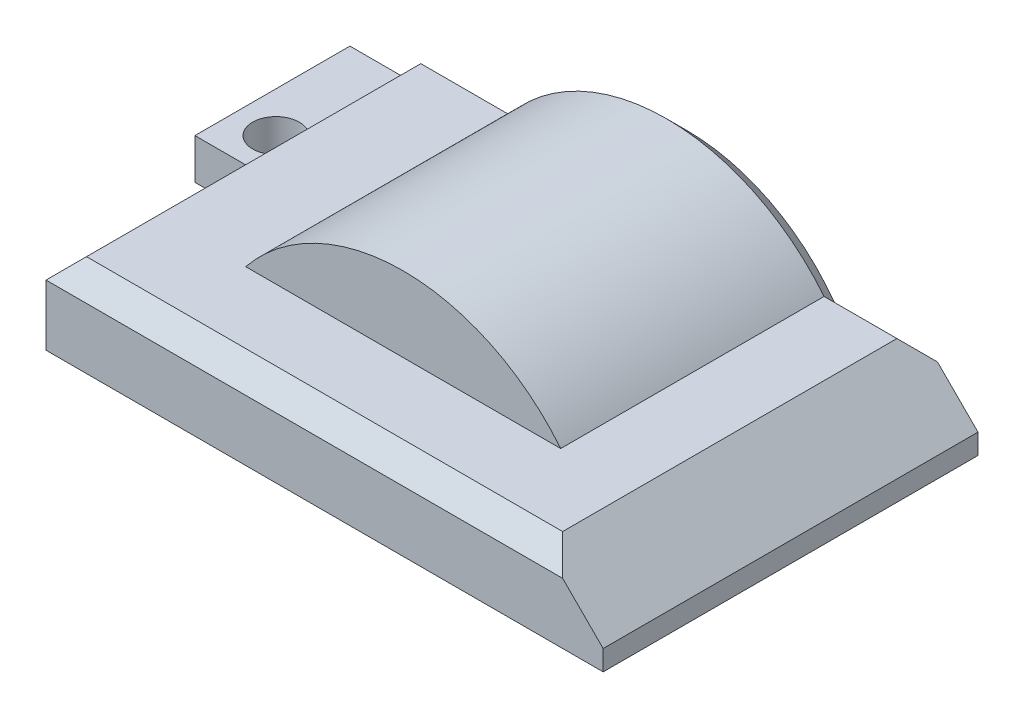
ISO-10303-21;
HEADER;
FILE_DESCRIPTION(('STEP AP214'),'2;1');
FILE_NAME('part.step','',(''),(''),'','','');
FILE_SCHEMA(('AUTOMOTIVE_DESIGN { 1 0 10303 214 1 1 1 1 }'));
ENDSEC;
DATA;
#1=APPLICATION_CONTEXT('core data for automotive mechanical design processes');
#2=APPLICATION_PROTOCOL_DEFINITION('international standard','automotive_design',2000,#1);
#3=PRODUCT_CONTEXT('',#1,'mechanical');
#4=PRODUCT('Part','Part','',(#3));
#5=PRODUCT_RELATED_PRODUCT_CATEGORY('part','',(#4));
#6=PRODUCT_DEFINITION_FORMATION('','',#4);
#7=PRODUCT_DEFINITION_CONTEXT('part definition',#1,'design');
#8=PRODUCT_DEFINITION('design','',#6,#7);
#9=PRODUCT_DEFINITION_SHAPE('','',#8);
#10=(LENGTH_UNIT() NAMED_UNIT(*) SI_UNIT(.MILLI.,.METRE.));
#11=(NAMED_UNIT(*) PLANE_ANGLE_UNIT() SI_UNIT($,.RADIAN.));
#12=(NAMED_UNIT(*) SI_UNIT($,.STERADIAN.) SOLID_ANGLE_UNIT());
#13=UNCERTAINTY_MEASURE_WITH_UNIT(LENGTH_MEASURE(1.E-05),#10,'distance_accuracy_value','');
#14=(GEOMETRIC_REPRESENTATION_CONTEXT(3) GLOBAL_UNCERTAINTY_ASSIGNED_CONTEXT((#13)) GLOBAL_UNIT_ASSIGNED_CONTEXT((#10,
#11,#12)) REPRESENTATION_CONTEXT('',''));
#15=CARTESIAN_POINT('',(0.,0.,0.));
#16=DIRECTION('',(0.,0.,1.));
#17=DIRECTION('',(1.,0.,0.));
#18=AXIS2_PLACEMENT_3D('',#15,#16,#17);
#19=CARTESIAN_POINT('',(0.,2.,0.));
#20=DIRECTION('',(0.,0.,-1.));
#21=DIRECTION('',(-1.,0.,0.));
#22=AXIS2_PLACEMENT_3D('',#19,#20,#21);
#23=PLANE('',#22);
#24=DIRECTION('',(0.,-1.,0.));
#25=VECTOR('',#24,1.);
#26=CARTESIAN_POINT('',(23.5,2.,0.));
#27=LINE('',#26,#25);
#28=CARTESIAN_POINT('',(23.5,2.,0.));
#29=VERTEX_POINT('',#28);
#30=CARTESIAN_POINT('',(23.5,0.,0.));
#31=VERTEX_POINT('',#30);
#32=EDGE_CURVE('E352',#29,#31,#27,.T.);
#33=ORIENTED_EDGE('',*,*,#32,.T.);
#34=DIRECTION('',(1.,0.,0.));
#35=VECTOR('',#34,1.);
#36=CARTESIAN_POINT('',(0.,0.,0.));
#37=LINE('',#36,#35);
#38=CARTESIAN_POINT('',(0.,0.,0.));
#39=VERTEX_POINT('',#38);
#40=EDGE_CURVE('E344',#39,#31,#37,.T.);
#41=ORIENTED_EDGE('',*,*,#40,.F.);
#42=DIRECTION('',(0.,-1.,0.));
#43=VECTOR('',#42,1.);
#44=CARTESIAN_POINT('',(0.,2.,0.));
#45=LINE('',#44,#43);
#46=CARTESIAN_POINT('',(0.,2.,0.));
#47=VERTEX_POINT('',#46);
#48=EDGE_CURVE('E223',#47,#39,#45,.T.);
#49=ORIENTED_EDGE('',*,*,#48,.F.);
#50=DIRECTION('',(1.,0.,0.));
#51=VECTOR('',#50,1.);
#52=CARTESIAN_POINT('',(0.,2.,0.));
#53=LINE('',#52,#51);
#54=EDGE_CURVE('E333',#47,#29,#53,.T.);
#55=ORIENTED_EDGE('',*,*,#54,.T.);
#56=EDGE_LOOP('',(#33,#41,#49,#55));
#57=FACE_BOUND('',#56,.T.);
#58=ADVANCED_FACE('F42',(#57),#23,.T.);
#59=CARTESIAN_POINT('',(0.,2.,-16.));
#60=DIRECTION('',(0.,0.,1.));
#61=DIRECTION('',(1.,0.,0.));
#62=AXIS2_PLACEMENT_3D('',#59,#60,#61);
#63=PLANE('',#62);
#64=DIRECTION('',(-1.,0.,0.));
#65=VECTOR('',#64,1.);
#66=CARTESIAN_POINT('',(0.,0.,-16.));
#67=LINE('',#66,#65);
#68=CARTESIAN_POINT('',(23.5,0.,-16.));
#69=VERTEX_POINT('',#68);
#70=CARTESIAN_POINT('',(-5.5,0.,-16.));
#71=VERTEX_POINT('',#70);
#72=EDGE_CURVE('E334',#69,#71,#67,.T.);
#73=ORIENTED_EDGE('',*,*,#72,.F.);
#74=DIRECTION('',(0.,-1.,0.));
#75=VECTOR('',#74,1.);
#76=CARTESIAN_POINT('',(23.5,2.,-16.));
#77=LINE('',#76,#75);
#78=CARTESIAN_POINT('',(23.5,2.,-16.));
#79=VERTEX_POINT('',#78);
#80=EDGE_CURVE('E71',#79,#69,#77,.T.);
#81=ORIENTED_EDGE('',*,*,#80,.F.);
#82=DIRECTION('',(-1.,0.,0.));
#83=VECTOR('',#82,1.);
#84=CARTESIAN_POINT('',(0.,2.,-16.));
#85=LINE('',#84,#83);
#86=CARTESIAN_POINT('',(18.5835830309992,2.,-16.));
#87=VERTEX_POINT('',#86);
#88=EDGE_CURVE('E340',#79,#87,#85,.T.);
#89=ORIENTED_EDGE('',*,*,#88,.T.);
#90=CARTESIAN_POINT('',(11.13,-2.29,-16.));
#91=DIRECTION('',(0.,0.,-1.));
#92=DIRECTION('',(1.,0.,0.));
#93=AXIS2_PLACEMENT_3D('',#90,#91,#92);
#94=CIRCLE('',#93,8.59999999999999);
#95=CARTESIAN_POINT('',(3.67641696900076,2.,-16.));
#96=VERTEX_POINT('',#95);
#97=EDGE_CURVE('E307',#96,#87,#94,.T.);
#98=ORIENTED_EDGE('',*,*,#97,.F.);
#99=CARTESIAN_POINT('',(0.,2.,-16.));
#100=VERTEX_POINT('',#99);
#101=EDGE_CURVE('E339',#96,#100,#85,.T.);
#102=ORIENTED_EDGE('',*,*,#101,.T.);
#103=DIRECTION('',(0.,-1.,0.));
#104=VECTOR('',#103,1.);
#105=CARTESIAN_POINT('',(0.,2.,-16.));
#106=LINE('',#105,#104);
#107=CARTESIAN_POINT('',(0.,1.5,-16.));
#108=VERTEX_POINT('',#107);
#109=EDGE_CURVE('E342',#100,#108,#106,.T.);
#110=ORIENTED_EDGE('',*,*,#109,.T.);
#111=DIRECTION('',(1.,0.,0.));
#112=VECTOR('',#111,1.);
#113=CARTESIAN_POINT('',(-2.001,1.5,-16.));
#114=LINE('',#113,#112);
#115=CARTESIAN_POINT('',(-5.5,1.5,-16.));
#116=VERTEX_POINT('',#115);
#117=EDGE_CURVE('E324',#116,#108,#114,.T.);
#118=ORIENTED_EDGE('',*,*,#117,.F.);
#119=DIRECTION('',(0.,1.,0.));
#120=VECTOR('',#119,1.);
#121=CARTESIAN_POINT('',(-5.5,0.,-16.));
#122=LINE('',#121,#120);
#123=EDGE_CURVE('E257',#71,#116,#122,.T.);
#124=ORIENTED_EDGE('',*,*,#123,.F.);
#125=EDGE_LOOP('',(#73,#81,#89,#98,#102,#110,#118,#124));
#126=FACE_BOUND('',#125,.T.);
#127=ADVANCED_FACE('F424',(#126),#63,.T.);
#128=CARTESIAN_POINT('',(0.,4.,0.));
#129=DIRECTION('',(0.,-1.,0.));
#130=DIRECTION('',(0.,0.,-1.));
#131=AXIS2_PLACEMENT_3D('',#128,#129,#130);
#132=PLANE('',#131);
#133=DIRECTION('',(0.,0.,-1.));
#134=VECTOR('',#133,1.);
#135=CARTESIAN_POINT('',(22.5,4.,0.));
#136=LINE('',#135,#134);
#137=CARTESIAN_POINT('',(22.5,4.,-0.500000000000008));
#138=VERTEX_POINT('',#137);
#139=CARTESIAN_POINT('',(22.5,4.,-17.));
#140=VERTEX_POINT('',#139);
#141=EDGE_CURVE('E363',#138,#140,#136,.T.);
#142=ORIENTED_EDGE('',*,*,#141,.T.);
#143=DIRECTION('',(-1.,0.,0.));
#144=VECTOR('',#143,1.);
#145=CARTESIAN_POINT('',(0.,4.,-17.));
#146=LINE('',#145,#144);
#147=CARTESIAN_POINT('',(18.9040529969894,4.,-17.));
#148=VERTEX_POINT('',#147);
#149=EDGE_CURVE('E378',#140,#148,#146,.T.);
#150=ORIENTED_EDGE('',*,*,#149,.T.);
#151=DIRECTION('',(0.,0.,1.));
#152=VECTOR('',#151,1.);
#153=CARTESIAN_POINT('',(18.9040529969894,4.,-24.892497143019));
#154=LINE('',#153,#152);
#155=CARTESIAN_POINT('',(18.9040529969894,4.,-4.));
#156=VERTEX_POINT('',#155);
#157=EDGE_CURVE('E300',#148,#156,#154,.T.);
#158=ORIENTED_EDGE('',*,*,#157,.T.);
#159=DIRECTION('',(1.,0.,0.));
#160=VECTOR('',#159,1.);
#161=CARTESIAN_POINT('',(3.3559470030106,4.,-4.));
#162=LINE('',#161,#160);
#163=CARTESIAN_POINT('',(3.3559470030106,4.,-4.));
#164=VERTEX_POINT('',#163);
#165=EDGE_CURVE('E297',#164,#156,#162,.T.);
#166=ORIENTED_EDGE('',*,*,#165,.F.);
#167=DIRECTION('',(0.,0.,1.));
#168=VECTOR('',#167,1.);
#169=CARTESIAN_POINT('',(3.3559470030106,4.,-24.892497143019));
#170=LINE('',#169,#168);
#171=CARTESIAN_POINT('',(3.3559470030106,4.,-17.));
#172=VERTEX_POINT('',#171);
#173=EDGE_CURVE('E302',#172,#164,#170,.T.);
#174=ORIENTED_EDGE('',*,*,#173,.F.);
#175=DIRECTION('',(-1.,0.,0.));
#176=VECTOR('',#175,1.);
#177=CARTESIAN_POINT('',(0.,4.,-17.));
#178=LINE('',#177,#176);
#179=CARTESIAN_POINT('',(-0.999999999999996,4.,-17.));
#180=VERTEX_POINT('',#179);
#181=EDGE_CURVE('E374',#172,#180,#178,.T.);
#182=ORIENTED_EDGE('',*,*,#181,.T.);
#183=DIRECTION('',(0.,0.,1.));
#184=VECTOR('',#183,1.);
#185=CARTESIAN_POINT('',(-0.999999999999996,4.,0.));
#186=LINE('',#185,#184);
#187=CARTESIAN_POINT('',(-0.999999999999996,4.,-0.500000000000008));
#188=VERTEX_POINT('',#187);
#189=EDGE_CURVE('E372',#180,#188,#186,.T.);
#190=ORIENTED_EDGE('',*,*,#189,.T.);
#191=DIRECTION('',(1.,0.,0.));
#192=VECTOR('',#191,1.);
#193=CARTESIAN_POINT('',(0.,4.,-0.500000000000008));
#194=LINE('',#193,#192);
#195=EDGE_CURVE('E376',#188,#138,#194,.T.);
#196=ORIENTED_EDGE('',*,*,#195,.T.);
#197=EDGE_LOOP('',(#142,#150,#158,#166,#174,#182,#190,#196));
#198=FACE_BOUND('',#197,.T.);
#199=ADVANCED_FACE('F430',(#198),#132,.F.);
#200=CARTESIAN_POINT('',(-2.,2.,2.));
#201=DIRECTION('',(1.,0.,0.));
#202=DIRECTION('',(0.,0.,-1.));
#203=AXIS2_PLACEMENT_3D('',#200,#201,#202);
#204=PLANE('',#203);
#205=DIRECTION('',(0.,-1.,0.));
#206=VECTOR('',#205,1.);
#207=CARTESIAN_POINT('',(-2.,0.,0.5));
#208=LINE('',#207,#206);
#209=CARTESIAN_POINT('',(-2.,2.99999999999999,0.5));
#210=VERTEX_POINT('',#209);
#211=CARTESIAN_POINT('',(-2.,0.,0.5));
#212=VERTEX_POINT('',#211);
#213=EDGE_CURVE('E233',#210,#212,#208,.T.);
#214=ORIENTED_EDGE('',*,*,#213,.F.);
#215=DIRECTION('',(0.,0.,1.));
#216=VECTOR('',#215,1.);
#217=CARTESIAN_POINT('',(-2.,2.99999999999999,0.));
#218=LINE('',#217,#216);
#219=CARTESIAN_POINT('',(-2.,2.99999999999999,-10.6729490168752));
#220=VERTEX_POINT('',#219);
#221=EDGE_CURVE('E392',#210,#220,#218,.F.);
#222=ORIENTED_EDGE('',*,*,#221,.T.);
#223=DIRECTION('',(0.,-1.,0.));
#224=VECTOR('',#223,1.);
#225=CARTESIAN_POINT('',(-2.,7.711,-10.6729490168752));
#226=LINE('',#225,#224);
#227=CARTESIAN_POINT('',(-2.,2.,-10.6729490168752));
#228=VERTEX_POINT('',#227);
#229=EDGE_CURVE('E247',#220,#228,#226,.T.);
#230=ORIENTED_EDGE('',*,*,#229,.T.);
#231=DIRECTION('',(0.,0.,1.));
#232=VECTOR('',#231,1.);
#233=CARTESIAN_POINT('',(-2.,2.,-18.));
#234=LINE('',#233,#232);
#235=CARTESIAN_POINT('',(-2.,2.,-10.35));
#236=VERTEX_POINT('',#235);
#237=EDGE_CURVE('E271',#228,#236,#234,.T.);
#238=ORIENTED_EDGE('',*,*,#237,.T.);
#239=DIRECTION('',(0.,-1.,0.));
#240=VECTOR('',#239,1.);
#241=CARTESIAN_POINT('',(-2.,2.,-10.35));
#242=LINE('',#241,#240);
#243=CARTESIAN_POINT('',(-2.,0.,-10.35));
#244=VERTEX_POINT('',#243);
#245=EDGE_CURVE('E280',#236,#244,#242,.T.);
#246=ORIENTED_EDGE('',*,*,#245,.T.);
#247=DIRECTION('',(0.,0.,1.));
#248=VECTOR('',#247,1.);
#249=CARTESIAN_POINT('',(-2.,0.,2.));
#250=LINE('',#249,#248);
#251=EDGE_CURVE('E357',#244,#212,#250,.T.);
#252=ORIENTED_EDGE('',*,*,#251,.T.);
#253=EDGE_LOOP('',(#214,#222,#230,#238,#246,#252));
#254=FACE_BOUND('',#253,.T.);
#255=ADVANCED_FACE('F444',(#254),#204,.F.);
#256=DIRECTION('',(0.,-1.,0.));
#257=VECTOR('',#256,1.);
#258=CARTESIAN_POINT('',(-2.,7.711,-14.0270509831248));
#259=LINE('',#258,#257);
#260=CARTESIAN_POINT('',(-2.,2.,-14.0270509831248));
#261=VERTEX_POINT('',#260);
#262=CARTESIAN_POINT('',(-2.,2.99999999999999,-14.0270509831248));
#263=VERTEX_POINT('',#262);
#264=EDGE_CURVE('E234',#261,#263,#259,.F.);
#265=ORIENTED_EDGE('',*,*,#264,.T.);
#266=DIRECTION('',(0.,0.,-1.));
#267=VECTOR('',#266,1.);
#268=CARTESIAN_POINT('',(-2.,2.99999999999999,2.));
#269=LINE('',#268,#267);
#270=CARTESIAN_POINT('',(-2.,2.99999999999999,-18.));
#271=VERTEX_POINT('',#270);
#272=EDGE_CURVE('E11',#263,#271,#269,.T.);
#273=ORIENTED_EDGE('',*,*,#272,.T.);
#274=DIRECTION('',(0.,-1.,0.));
#275=VECTOR('',#274,1.);
#276=CARTESIAN_POINT('',(-2.,2.,-18.));
#277=LINE('',#276,#275);
#278=CARTESIAN_POINT('',(-2.,2.,-18.));
#279=VERTEX_POINT('',#278);
#280=EDGE_CURVE('E359',#271,#279,#277,.T.);
#281=ORIENTED_EDGE('',*,*,#280,.T.);
#282=EDGE_CURVE('E267',#279,#261,#234,.T.);
#283=ORIENTED_EDGE('',*,*,#282,.T.);
#284=EDGE_LOOP('',(#265,#273,#281,#283));
#285=FACE_BOUND('',#284,.T.);
#286=ADVANCED_FACE('F447',(#285),#204,.F.);
#287=CARTESIAN_POINT('',(11.13,-2.29,2.94697073413056));
#288=DIRECTION('',(0.,0.,-1.));
#289=DIRECTION('',(-1.,0.,0.));
#290=AXIS2_PLACEMENT_3D('',#287,#288,#289);
#291=CYLINDRICAL_SURFACE('',#290,10.);
#292=ORIENTED_EDGE('',*,*,#157,.F.);
#293=CARTESIAN_POINT('',(11.13,-2.29,-17.));
#294=DIRECTION('',(0.,0.,1.));
#295=DIRECTION('',(1.,0.,0.));
#296=AXIS2_PLACEMENT_3D('',#293,#294,#295);
#297=CIRCLE('',#296,10.);
#298=EDGE_CURVE('E390',#148,#172,#297,.T.);
#299=ORIENTED_EDGE('',*,*,#298,.T.);
#300=ORIENTED_EDGE('',*,*,#173,.T.);
#301=CARTESIAN_POINT('',(11.13,-2.29,-4.));
#302=DIRECTION('',(0.,0.,1.));
#303=DIRECTION('',(1.,0.,0.));
#304=AXIS2_PLACEMENT_3D('',#301,#302,#303);
#305=CIRCLE('',#304,10.);
#306=EDGE_CURVE('E290',#156,#164,#305,.T.);
#307=ORIENTED_EDGE('',*,*,#306,.F.);
#308=EDGE_LOOP('',(#292,#299,#300,#307));
#309=FACE_BOUND('',#308,.T.);
#310=ADVANCED_FACE('F443',(#309),#291,.T.);
#311=CARTESIAN_POINT('',(0.,0.,0.));
#312=DIRECTION('',(0.,1.,0.));
#313=DIRECTION('',(0.,0.,1.));
#314=AXIS2_PLACEMENT_3D('',#311,#312,#313);
#315=PLANE('',#314);
#316=DIRECTION('',(0.,0.,-1.));
#317=VECTOR('',#316,1.);
#318=CARTESIAN_POINT('',(23.5,0.,0.));
#319=LINE('',#318,#317);
#320=EDGE_CURVE('E66',#31,#69,#319,.T.);
#321=ORIENTED_EDGE('',*,*,#320,.T.);
#322=ORIENTED_EDGE('',*,*,#72,.T.);
#323=DIRECTION('',(0.,0.,-1.));
#324=VECTOR('',#323,1.);
#325=CARTESIAN_POINT('',(-5.5,0.,-18.));
#326=LINE('',#325,#324);
#327=CARTESIAN_POINT('',(-5.5,0.,-18.));
#328=VERTEX_POINT('',#327);
#329=EDGE_CURVE('E283',#71,#328,#326,.T.);
#330=ORIENTED_EDGE('',*,*,#329,.T.);
#331=DIRECTION('',(-1.,0.,0.));
#332=VECTOR('',#331,1.);
#333=CARTESIAN_POINT('',(-2.,0.,-18.));
#334=LINE('',#333,#332);
#335=CARTESIAN_POINT('',(25.5,0.,-18.));
#336=VERTEX_POINT('',#335);
#337=EDGE_CURVE('E218',#336,#328,#334,.T.);
#338=ORIENTED_EDGE('',*,*,#337,.F.);
#339=DIRECTION('',(0.,0.,-1.));
#340=VECTOR('',#339,1.);
#341=CARTESIAN_POINT('',(25.5,0.,2.));
#342=LINE('',#341,#340);
#343=CARTESIAN_POINT('',(25.5,0.,0.5));
#344=VERTEX_POINT('',#343);
#345=EDGE_CURVE('E210',#344,#336,#342,.T.);
#346=ORIENTED_EDGE('',*,*,#345,.F.);
#347=DIRECTION('',(-1.,0.,0.));
#348=VECTOR('',#347,1.);
#349=CARTESIAN_POINT('',(25.501,0.,0.5));
#350=LINE('',#349,#348);
#351=EDGE_CURVE('E215',#344,#212,#350,.T.);
#352=ORIENTED_EDGE('',*,*,#351,.T.);
#353=ORIENTED_EDGE('',*,*,#251,.F.);
#354=DIRECTION('',(-1.,0.,0.));
#355=VECTOR('',#354,1.);
#356=CARTESIAN_POINT('',(-2.,0.,-10.35));
#357=LINE('',#356,#355);
#358=CARTESIAN_POINT('',(-5.5,0.,-10.35));
#359=VERTEX_POINT('',#358);
#360=EDGE_CURVE('E264',#244,#359,#357,.T.);
#361=ORIENTED_EDGE('',*,*,#360,.T.);
#362=CARTESIAN_POINT('',(-5.5,0.,-14.6));
#363=VERTEX_POINT('',#362);
#364=EDGE_CURVE('E284',#359,#363,#326,.T.);
#365=ORIENTED_EDGE('',*,*,#364,.T.);
#366=DIRECTION('',(1.,0.,0.));
#367=VECTOR('',#366,1.);
#368=CARTESIAN_POINT('',(-2.001,0.,-14.6));
#369=LINE('',#368,#367);
#370=CARTESIAN_POINT('',(0.,0.,-14.6));
#371=VERTEX_POINT('',#370);
#372=EDGE_CURVE('E327',#363,#371,#369,.T.);
#373=ORIENTED_EDGE('',*,*,#372,.T.);
#374=DIRECTION('',(0.,0.,1.));
#375=VECTOR('',#374,1.);
#376=CARTESIAN_POINT('',(0.,0.,0.));
#377=LINE('',#376,#375);
#378=EDGE_CURVE('E326',#371,#39,#377,.T.);
#379=ORIENTED_EDGE('',*,*,#378,.T.);
#380=ORIENTED_EDGE('',*,*,#40,.T.);
#381=EDGE_LOOP('',(#321,#322,#330,#338,#346,#352,#353,#361,#365,#373,#379,#380));
#382=FACE_BOUND('',#381,.T.);
#383=CARTESIAN_POINT('',(-3.5,0.,-12.35));
#384=DIRECTION('',(0.,-1.,0.));
#385=DIRECTION('',(0.,0.,-1.));
#386=AXIS2_PLACEMENT_3D('',#383,#384,#385);
#387=CIRCLE('',#386,1.15);
#388=CARTESIAN_POINT('',(-3.5,0.,-13.5));
#389=VERTEX_POINT('',#388);
#390=EDGE_CURVE('E260',#389,#389,#387,.T.);
#391=ORIENTED_EDGE('',*,*,#390,.F.);
#392=EDGE_LOOP('',(#391));
#393=FACE_BOUND('',#392,.T.);
#394=ADVANCED_FACE('F212',(#382,#393),#315,.F.);
#395=CARTESIAN_POINT('',(25.5,2.,2.));
#396=DIRECTION('',(-1.,0.,0.));
#397=DIRECTION('',(0.,0.,1.));
#398=AXIS2_PLACEMENT_3D('',#395,#396,#397);
#399=PLANE('',#398);
#400=DIRECTION('',(0.,0.,1.));
#401=VECTOR('',#400,1.);
#402=CARTESIAN_POINT('',(25.5,0.999999999999997,2.));
#403=LINE('',#402,#401);
#404=CARTESIAN_POINT('',(25.5,0.999999999999997,-18.));
#405=VERTEX_POINT('',#404);
#406=CARTESIAN_POINT('',(25.5,0.999999999999997,0.5));
#407=VERTEX_POINT('',#406);
#408=EDGE_CURVE('E237',#405,#407,#403,.T.);
#409=ORIENTED_EDGE('',*,*,#408,.T.);
#410=DIRECTION('',(0.,1.,0.));
#411=VECTOR('',#410,1.);
#412=CARTESIAN_POINT('',(25.5,0.,0.5));
#413=LINE('',#412,#411);
#414=EDGE_CURVE('E229',#344,#407,#413,.T.);
#415=ORIENTED_EDGE('',*,*,#414,.F.);
#416=ORIENTED_EDGE('',*,*,#345,.T.);
#417=DIRECTION('',(0.,-1.,0.));
#418=VECTOR('',#417,1.);
#419=CARTESIAN_POINT('',(25.5,2.,-18.));
#420=LINE('',#419,#418);
#421=EDGE_CURVE('E361',#405,#336,#420,.T.);
#422=ORIENTED_EDGE('',*,*,#421,.F.);
#423=EDGE_LOOP('',(#409,#415,#416,#422));
#424=FACE_BOUND('',#423,.T.);
#425=ADVANCED_FACE('F236',(#424),#399,.F.);
#426=CARTESIAN_POINT('',(-2.,2.,-18.));
#427=DIRECTION('',(0.,0.,1.));
#428=DIRECTION('',(1.,0.,0.));
#429=AXIS2_PLACEMENT_3D('',#426,#427,#428);
#430=PLANE('',#429);
#431=CARTESIAN_POINT('',(11.13,-2.29,-18.));
#432=DIRECTION('',(0.,0.,1.));
#433=DIRECTION('',(1.,0.,0.));
#434=AXIS2_PLACEMENT_3D('',#431,#432,#433);
#435=CIRCLE('',#434,8.99999999999999);
#436=CARTESIAN_POINT('',(3.84879817612505,2.99999999999999,-18.));
#437=VERTEX_POINT('',#436);
#438=CARTESIAN_POINT('',(18.411201823875,2.99999999999999,-18.));
#439=VERTEX_POINT('',#438);
#440=EDGE_CURVE('E386',#437,#439,#435,.F.);
#441=ORIENTED_EDGE('',*,*,#440,.T.);
#442=DIRECTION('',(1.,0.,0.));
#443=VECTOR('',#442,1.);
#444=CARTESIAN_POINT('',(-2.,2.99999999999999,-18.));
#445=LINE('',#444,#443);
#446=CARTESIAN_POINT('',(23.5,2.99999999999999,-18.));
#447=VERTEX_POINT('',#446);
#448=EDGE_CURVE('E388',#439,#447,#445,.T.);
#449=ORIENTED_EDGE('',*,*,#448,.T.);
#450=DIRECTION('',(-0.707106781186547,0.707106781186548,0.));
#451=VECTOR('',#450,1.);
#452=CARTESIAN_POINT('',(22.5,4.,-18.));
#453=LINE('',#452,#451);
#454=EDGE_CURVE('E366',#447,#405,#453,.F.);
#455=ORIENTED_EDGE('',*,*,#454,.T.);
#456=ORIENTED_EDGE('',*,*,#421,.T.);
#457=ORIENTED_EDGE('',*,*,#337,.T.);
#458=DIRECTION('',(0.,-1.,0.));
#459=VECTOR('',#458,1.);
#460=CARTESIAN_POINT('',(-5.5,2.,-18.));
#461=LINE('',#460,#459);
#462=CARTESIAN_POINT('',(-5.5,2.,-18.));
#463=VERTEX_POINT('',#462);
#464=EDGE_CURVE('E287',#463,#328,#461,.T.);
#465=ORIENTED_EDGE('',*,*,#464,.F.);
#466=DIRECTION('',(1.,0.,0.));
#467=VECTOR('',#466,1.);
#468=CARTESIAN_POINT('',(-2.,2.,-18.));
#469=LINE('',#468,#467);
#470=EDGE_CURVE('E277',#463,#279,#469,.T.);
#471=ORIENTED_EDGE('',*,*,#470,.T.);
#472=ORIENTED_EDGE('',*,*,#280,.F.);
#473=DIRECTION('',(1.,0.,0.));
#474=VECTOR('',#473,1.);
#475=CARTESIAN_POINT('',(-2.,2.99999999999999,-18.));
#476=LINE('',#475,#474);
#477=EDGE_CURVE('E384',#271,#437,#476,.T.);
#478=ORIENTED_EDGE('',*,*,#477,.T.);
#479=EDGE_LOOP('',(#441,#449,#455,#456,#457,#465,#471,#472,#478));
#480=FACE_BOUND('',#479,.T.);
#481=ADVANCED_FACE('F439',(#480),#430,.F.);
#482=CARTESIAN_POINT('',(0.,2.,0.));
#483=DIRECTION('',(1.,0.,0.));
#484=DIRECTION('',(0.,0.,-1.));
#485=AXIS2_PLACEMENT_3D('',#482,#483,#484);
#486=PLANE('',#485);
#487=DIRECTION('',(0.,0.,1.));
#488=VECTOR('',#487,1.);
#489=CARTESIAN_POINT('',(0.,1.5,-16.));
#490=LINE('',#489,#488);
#491=CARTESIAN_POINT('',(0.,1.5,-14.6));
#492=VERTEX_POINT('',#491);
#493=EDGE_CURVE('E318',#108,#492,#490,.T.);
#494=ORIENTED_EDGE('',*,*,#493,.F.);
#495=ORIENTED_EDGE('',*,*,#109,.F.);
#496=DIRECTION('',(0.,0.,1.));
#497=VECTOR('',#496,1.);
#498=CARTESIAN_POINT('',(0.,2.,0.));
#499=LINE('',#498,#497);
#500=EDGE_CURVE('E331',#100,#47,#499,.T.);
#501=ORIENTED_EDGE('',*,*,#500,.T.);
#502=ORIENTED_EDGE('',*,*,#48,.T.);
#503=ORIENTED_EDGE('',*,*,#378,.F.);
#504=DIRECTION('',(0.,-1.,0.));
#505=VECTOR('',#504,1.);
#506=CARTESIAN_POINT('',(0.,1.5,-14.6));
#507=LINE('',#506,#505);
#508=EDGE_CURVE('E321',#492,#371,#507,.T.);
#509=ORIENTED_EDGE('',*,*,#508,.F.);
#510=EDGE_LOOP('',(#494,#495,#501,#502,#503,#509));
#511=FACE_BOUND('',#510,.T.);
#512=ADVANCED_FACE('F436',(#511),#486,.T.);
#513=CARTESIAN_POINT('',(23.5,2.,0.));
#514=DIRECTION('',(-1.,0.,0.));
#515=DIRECTION('',(0.,0.,1.));
#516=AXIS2_PLACEMENT_3D('',#513,#514,#515);
#517=PLANE('',#516);
#518=ORIENTED_EDGE('',*,*,#320,.F.);
#519=ORIENTED_EDGE('',*,*,#32,.F.);
#520=DIRECTION('',(0.,0.,-1.));
#521=VECTOR('',#520,1.);
#522=CARTESIAN_POINT('',(23.5,2.,0.));
#523=LINE('',#522,#521);
#524=EDGE_CURVE('E337',#29,#79,#523,.T.);
#525=ORIENTED_EDGE('',*,*,#524,.T.);
#526=ORIENTED_EDGE('',*,*,#80,.T.);
#527=EDGE_LOOP('',(#518,#519,#525,#526));
#528=FACE_BOUND('',#527,.T.);
#529=ADVANCED_FACE('F435',(#528),#517,.T.);
#530=CARTESIAN_POINT('',(-2.001,1.5,-16.));
#531=DIRECTION('',(0.,1.,0.));
#532=DIRECTION('',(0.,0.,1.));
#533=AXIS2_PLACEMENT_3D('',#530,#531,#532);
#534=PLANE('',#533);
#535=DIRECTION('',(1.,0.,0.));
#536=VECTOR('',#535,1.);
#537=CARTESIAN_POINT('',(-2.001,1.5,-14.6));
#538=LINE('',#537,#536);
#539=CARTESIAN_POINT('',(-5.5,1.5,-14.6));
#540=VERTEX_POINT('',#539);
#541=EDGE_CURVE('E323',#540,#492,#538,.T.);
#542=ORIENTED_EDGE('',*,*,#541,.F.);
#543=DIRECTION('',(0.,0.,1.));
#544=VECTOR('',#543,1.);
#545=CARTESIAN_POINT('',(-5.5,1.5,-16.));
#546=LINE('',#545,#544);
#547=EDGE_CURVE('E251',#116,#540,#546,.T.);
#548=ORIENTED_EDGE('',*,*,#547,.F.);
#549=ORIENTED_EDGE('',*,*,#117,.T.);
#550=ORIENTED_EDGE('',*,*,#493,.T.);
#551=EDGE_LOOP('',(#542,#548,#549,#550));
#552=FACE_BOUND('',#551,.T.);
#553=ADVANCED_FACE('F573',(#552),#534,.F.);
#554=CARTESIAN_POINT('',(-2.001,1.5,-14.6));
#555=DIRECTION('',(0.,0.,1.));
#556=DIRECTION('',(1.,0.,0.));
#557=AXIS2_PLACEMENT_3D('',#554,#555,#556);
#558=PLANE('',#557);
#559=ORIENTED_EDGE('',*,*,#372,.F.);
#560=DIRECTION('',(0.,-1.,0.));
#561=VECTOR('',#560,1.);
#562=CARTESIAN_POINT('',(-5.5,1.5,-14.6));
#563=LINE('',#562,#561);
#564=EDGE_CURVE('E254',#540,#363,#563,.T.);
#565=ORIENTED_EDGE('',*,*,#564,.F.);
#566=ORIENTED_EDGE('',*,*,#541,.T.);
#567=ORIENTED_EDGE('',*,*,#508,.T.);
#568=EDGE_LOOP('',(#559,#565,#566,#567));
#569=FACE_BOUND('',#568,.T.);
#570=ADVANCED_FACE('F492',(#569),#558,.F.);
#571=CARTESIAN_POINT('',(2.09695510915616,2.,-5.));
#572=DIRECTION('',(0.,1.,0.));
#573=DIRECTION('',(0.,0.,1.));
#574=AXIS2_PLACEMENT_3D('',#571,#572,#573);
#575=PLANE('',#574);
#576=DIRECTION('',(0.,0.,-1.));
#577=VECTOR('',#576,1.);
#578=CARTESIAN_POINT('',(18.5835830309992,2.,-5.));
#579=LINE('',#578,#577);
#580=CARTESIAN_POINT('',(18.5835830309992,2.,-5.));
#581=VERTEX_POINT('',#580);
#582=EDGE_CURVE('E310',#581,#87,#579,.T.);
#583=ORIENTED_EDGE('',*,*,#582,.T.);
#584=ORIENTED_EDGE('',*,*,#88,.F.);
#585=ORIENTED_EDGE('',*,*,#524,.F.);
#586=ORIENTED_EDGE('',*,*,#54,.F.);
#587=ORIENTED_EDGE('',*,*,#500,.F.);
#588=ORIENTED_EDGE('',*,*,#101,.F.);
#589=DIRECTION('',(0.,0.,-1.));
#590=VECTOR('',#589,1.);
#591=CARTESIAN_POINT('',(3.67641696900076,2.,-5.));
#592=LINE('',#591,#590);
#593=CARTESIAN_POINT('',(3.67641696900076,2.,-5.));
#594=VERTEX_POINT('',#593);
#595=EDGE_CURVE('E315',#594,#96,#592,.T.);
#596=ORIENTED_EDGE('',*,*,#595,.F.);
#597=DIRECTION('',(-1.,0.,0.));
#598=VECTOR('',#597,1.);
#599=CARTESIAN_POINT('',(-2.,2.,-5.));
#600=LINE('',#599,#598);
#601=EDGE_CURVE('E304',#581,#594,#600,.T.);
#602=ORIENTED_EDGE('',*,*,#601,.F.);
#603=EDGE_LOOP('',(#583,#584,#585,#586,#587,#588,#596,#602));
#604=FACE_BOUND('',#603,.T.);
#605=ADVANCED_FACE('F564',(#604),#575,.F.);
#606=CARTESIAN_POINT('',(11.13,-2.29,-5.));
#607=DIRECTION('',(0.,0.,-1.));
#608=DIRECTION('',(-1.,0.,0.));
#609=AXIS2_PLACEMENT_3D('',#606,#607,#608);
#610=CYLINDRICAL_SURFACE('',#609,8.59999999999999);
#611=ORIENTED_EDGE('',*,*,#97,.T.);
#612=ORIENTED_EDGE('',*,*,#582,.F.);
#613=CARTESIAN_POINT('',(11.13,-2.29,-5.));
#614=DIRECTION('',(0.,0.,-1.));
#615=DIRECTION('',(1.,0.,0.));
#616=AXIS2_PLACEMENT_3D('',#613,#614,#615);
#617=CIRCLE('',#616,8.59999999999999);
#618=EDGE_CURVE('E308',#594,#581,#617,.T.);
#619=ORIENTED_EDGE('',*,*,#618,.F.);
#620=ORIENTED_EDGE('',*,*,#595,.T.);
#621=EDGE_LOOP('',(#611,#612,#619,#620));
#622=FACE_BOUND('',#621,.T.);
#623=ADVANCED_FACE('F560',(#622),#610,.F.);
#624=CARTESIAN_POINT('',(-2.,4.,-5.));
#625=DIRECTION('',(0.,0.,1.));
#626=DIRECTION('',(1.,0.,0.));
#627=AXIS2_PLACEMENT_3D('',#624,#625,#626);
#628=PLANE('',#627);
#629=ORIENTED_EDGE('',*,*,#601,.T.);
#630=ORIENTED_EDGE('',*,*,#618,.T.);
#631=EDGE_LOOP('',(#629,#630));
#632=FACE_BOUND('',#631,.T.);
#633=ADVANCED_FACE('F555',(#632),#628,.F.);
#634=CARTESIAN_POINT('',(11.13,-2.29,-4.));
#635=DIRECTION('',(0.,0.,1.));
#636=DIRECTION('',(1.,0.,0.));
#637=AXIS2_PLACEMENT_3D('',#634,#635,#636);
#638=PLANE('',#637);
#639=ORIENTED_EDGE('',*,*,#306,.T.);
#640=ORIENTED_EDGE('',*,*,#165,.T.);
#641=EDGE_LOOP('',(#639,#640));
#642=FACE_BOUND('',#641,.T.);
#643=ADVANCED_FACE('F461',(#642),#638,.T.);
#644=CARTESIAN_POINT('',(22.5,4.,0.));
#645=DIRECTION('',(-0.707106781186548,-0.707106781186547,0.));
#646=DIRECTION('',(0.,0.,-1.));
#647=AXIS2_PLACEMENT_3D('',#644,#645,#646);
#648=PLANE('',#647);
#649=ORIENTED_EDGE('',*,*,#408,.F.);
#650=ORIENTED_EDGE('',*,*,#454,.F.);
#651=DIRECTION('',(-0.577350269189625,0.577350269189627,0.577350269189625));
#652=VECTOR('',#651,1.);
#653=CARTESIAN_POINT('',(16.8333333333333,9.66666666666667,-11.3333333333333));
#654=LINE('',#653,#652);
#655=EDGE_CURVE('E380',#447,#140,#654,.T.);
#656=ORIENTED_EDGE('',*,*,#655,.T.);
#657=ORIENTED_EDGE('',*,*,#141,.F.);
#658=DIRECTION('',(0.577350269189624,-0.577350269189626,0.577350269189628));
#659=VECTOR('',#658,1.);
#660=CARTESIAN_POINT('',(22.6666666666667,3.83333333333333,-0.333333333333337));
#661=LINE('',#660,#659);
#662=CARTESIAN_POINT('',(23.5,3.,0.5));
#663=VERTEX_POINT('',#662);
#664=EDGE_CURVE('E382',#138,#663,#661,.T.);
#665=ORIENTED_EDGE('',*,*,#664,.T.);
#666=DIRECTION('',(-0.707106781186547,0.707106781186548,0.));
#667=VECTOR('',#666,1.);
#668=CARTESIAN_POINT('',(26.0005,0.499499999999997,0.5));
#669=LINE('',#668,#667);
#670=EDGE_CURVE('E238',#663,#407,#669,.F.);
#671=ORIENTED_EDGE('',*,*,#670,.T.);
#672=EDGE_LOOP('',(#649,#650,#656,#657,#665,#671));
#673=FACE_BOUND('',#672,.T.);
#674=ADVANCED_FACE('F455',(#673),#648,.F.);
#675=CARTESIAN_POINT('',(-5.5,2.,-18.));
#676=DIRECTION('',(-1.,0.,0.));
#677=DIRECTION('',(0.,0.,1.));
#678=AXIS2_PLACEMENT_3D('',#675,#676,#677);
#679=PLANE('',#678);
#680=ORIENTED_EDGE('',*,*,#564,.T.);
#681=ORIENTED_EDGE('',*,*,#364,.F.);
#682=DIRECTION('',(0.,-1.,0.));
#683=VECTOR('',#682,1.);
#684=CARTESIAN_POINT('',(-5.5,2.,-10.35));
#685=LINE('',#684,#683);
#686=CARTESIAN_POINT('',(-5.5,2.,-10.35));
#687=VERTEX_POINT('',#686);
#688=EDGE_CURVE('E291',#687,#359,#685,.T.);
#689=ORIENTED_EDGE('',*,*,#688,.F.);
#690=DIRECTION('',(0.,0.,-1.));
#691=VECTOR('',#690,1.);
#692=CARTESIAN_POINT('',(-5.5,2.,-18.));
#693=LINE('',#692,#691);
#694=EDGE_CURVE('E274',#687,#463,#693,.T.);
#695=ORIENTED_EDGE('',*,*,#694,.T.);
#696=ORIENTED_EDGE('',*,*,#464,.T.);
#697=ORIENTED_EDGE('',*,*,#329,.F.);
#698=ORIENTED_EDGE('',*,*,#123,.T.);
#699=ORIENTED_EDGE('',*,*,#547,.T.);
#700=EDGE_LOOP('',(#680,#681,#689,#695,#696,#697,#698,#699));
#701=FACE_BOUND('',#700,.T.);
#702=ADVANCED_FACE('F460',(#701),#679,.T.);
#703=CARTESIAN_POINT('',(-2.,2.,-10.35));
#704=DIRECTION('',(0.,0.,1.));
#705=DIRECTION('',(1.,0.,0.));
#706=AXIS2_PLACEMENT_3D('',#703,#704,#705);
#707=PLANE('',#706);
#708=ORIENTED_EDGE('',*,*,#360,.F.);
#709=ORIENTED_EDGE('',*,*,#245,.F.);
#710=DIRECTION('',(-1.,0.,0.));
#711=VECTOR('',#710,1.);
#712=CARTESIAN_POINT('',(-2.,2.,-10.35));
#713=LINE('',#712,#711);
#714=EDGE_CURVE('E270',#236,#687,#713,.T.);
#715=ORIENTED_EDGE('',*,*,#714,.T.);
#716=ORIENTED_EDGE('',*,*,#688,.T.);
#717=EDGE_LOOP('',(#708,#709,#715,#716));
#718=FACE_BOUND('',#717,.T.);
#719=ADVANCED_FACE('F485',(#718),#707,.T.);
#720=CARTESIAN_POINT('',(0.,2.,0.));
#721=DIRECTION('',(0.,-1.,0.));
#722=DIRECTION('',(0.,0.,-1.));
#723=AXIS2_PLACEMENT_3D('',#720,#721,#722);
#724=PLANE('',#723);
#725=CARTESIAN_POINT('',(-3.5,2.,-12.35));
#726=DIRECTION('',(0.,-1.,0.));
#727=DIRECTION('',(0.,0.,-1.));
#728=AXIS2_PLACEMENT_3D('',#725,#726,#727);
#729=CIRCLE('',#728,1.15);
#730=CARTESIAN_POINT('',(-3.5,2.,-13.5));
#731=VERTEX_POINT('',#730);
#732=EDGE_CURVE('E261',#731,#731,#729,.T.);
#733=ORIENTED_EDGE('',*,*,#732,.T.);
#734=EDGE_LOOP('',(#733));
#735=FACE_BOUND('',#734,.T.);
#736=ORIENTED_EDGE('',*,*,#282,.F.);
#737=ORIENTED_EDGE('',*,*,#470,.F.);
#738=ORIENTED_EDGE('',*,*,#694,.F.);
#739=ORIENTED_EDGE('',*,*,#714,.F.);
#740=ORIENTED_EDGE('',*,*,#237,.F.);
#741=CARTESIAN_POINT('',(-3.5,2.,-12.35));
#742=DIRECTION('',(0.,1.,0.));
#743=DIRECTION('',(0.,0.,1.));
#744=AXIS2_PLACEMENT_3D('',#741,#742,#743);
#745=CIRCLE('',#744,2.25);
#746=EDGE_CURVE('E249',#228,#261,#745,.T.);
#747=ORIENTED_EDGE('',*,*,#746,.T.);
#748=EDGE_LOOP('',(#736,#737,#738,#739,#740,#747));
#749=FACE_BOUND('',#748,.T.);
#750=ADVANCED_FACE('F536',(#735,#749),#724,.F.);
#751=CARTESIAN_POINT('',(-3.5,2.,-12.35));
#752=DIRECTION('',(0.,-1.,0.));
#753=DIRECTION('',(0.,0.,-1.));
#754=AXIS2_PLACEMENT_3D('',#751,#752,#753);
#755=CYLINDRICAL_SURFACE('',#754,1.15);
#756=ORIENTED_EDGE('',*,*,#732,.F.);
#757=EDGE_LOOP('',(#756));
#758=FACE_BOUND('',#757,.T.);
#759=ORIENTED_EDGE('',*,*,#390,.T.);
#760=EDGE_LOOP('',(#759));
#761=FACE_BOUND('',#760,.T.);
#762=ADVANCED_FACE('F539',(#758,#761),#755,.F.);
#763=CARTESIAN_POINT('',(-3.5,7.711,-12.35));
#764=DIRECTION('',(0.,-1.,0.));
#765=DIRECTION('',(0.,0.,-1.));
#766=AXIS2_PLACEMENT_3D('',#763,#764,#765);
#767=CYLINDRICAL_SURFACE('',#766,2.25);
#768=ORIENTED_EDGE('',*,*,#229,.F.);
#769=CARTESIAN_POINT('',(-3.5,1.49999999999999,-12.35));
#770=DIRECTION('',(0.707106781186549,-0.707106781186546,0.));
#771=DIRECTION('',(-0.707106781186546,-0.707106781186549,0.));
#772=AXIS2_PLACEMENT_3D('',#769,#770,#771);
#773=ELLIPSE('',#772,3.18198051533947,2.25);
#774=EDGE_CURVE('E58',#220,#263,#773,.F.);
#775=ORIENTED_EDGE('',*,*,#774,.T.);
#776=ORIENTED_EDGE('',*,*,#264,.F.);
#777=ORIENTED_EDGE('',*,*,#746,.F.);
#778=EDGE_LOOP('',(#768,#775,#776,#777));
#779=FACE_BOUND('',#778,.T.);
#780=ADVANCED_FACE('F529',(#779),#767,.F.);
#781=CARTESIAN_POINT('',(25.501,0.,0.5));
#782=DIRECTION('',(0.,0.,-1.));
#783=DIRECTION('',(0.,1.,0.));
#784=AXIS2_PLACEMENT_3D('',#781,#782,#783);
#785=PLANE('',#784);
#786=ORIENTED_EDGE('',*,*,#670,.F.);
#787=DIRECTION('',(-1.,0.,0.));
#788=VECTOR('',#787,1.);
#789=CARTESIAN_POINT('',(25.501,3.,0.5));
#790=LINE('',#789,#788);
#791=EDGE_CURVE('E370',#663,#210,#790,.T.);
#792=ORIENTED_EDGE('',*,*,#791,.T.);
#793=ORIENTED_EDGE('',*,*,#213,.T.);
#794=ORIENTED_EDGE('',*,*,#351,.F.);
#795=ORIENTED_EDGE('',*,*,#414,.T.);
#796=EDGE_LOOP('',(#786,#792,#793,#794,#795));
#797=FACE_BOUND('',#796,.T.);
#798=ADVANCED_FACE('F228',(#797),#785,.F.);
#799=CARTESIAN_POINT('',(0.,4.,-17.));
#800=DIRECTION('',(0.,-0.707106781186546,0.707106781186549));
#801=DIRECTION('',(-1.,0.,0.));
#802=AXIS2_PLACEMENT_3D('',#799,#800,#801);
#803=PLANE('',#802);
#804=ORIENTED_EDGE('',*,*,#655,.F.);
#805=ORIENTED_EDGE('',*,*,#448,.F.);
#806=CARTESIAN_POINT('',(18.9040529969894,4.,-17.));
#807=CARTESIAN_POINT('',(18.8641475211685,3.91638142704331,-17.0836185729567));
#808=CARTESIAN_POINT('',(18.8239667049612,3.83282845815613,-17.1671715418439));
#809=CARTESIAN_POINT('',(18.7430315454998,3.66586395665139,-17.3341360433486));
#810=CARTESIAN_POINT('',(18.7022772171082,3.58245242043114,-17.4175475795689));
#811=CARTESIAN_POINT('',(18.6201699899399,3.41577641144946,-17.5842235885505));
#812=CARTESIAN_POINT('',(18.5788170891948,3.33251193917265,-17.6674880608273));
#813=CARTESIAN_POINT('',(18.4954853101171,3.16613735828282,-17.8338626417172));
#814=CARTESIAN_POINT('',(18.453506415618,3.08302725371894,-17.9169727462811));
#815=CARTESIAN_POINT('',(18.411201823875,2.99999999999999,-18.));
#816=B_SPLINE_CURVE_WITH_KNOTS('',3,(#806,#807,#808,#809,#810,#811,#812,#813,#814,#815),
.UNSPECIFIED.,.F.,.F.,(4,2,2,2,4),(0.,0.374418338565289,0.748826991892583,1.12323687671356,
1.49765644760264),.UNSPECIFIED.);
#817=EDGE_CURVE('E48',#148,#439,#816,.T.);
#818=ORIENTED_EDGE('',*,*,#817,.F.);
#819=ORIENTED_EDGE('',*,*,#149,.F.);
#820=EDGE_LOOP('',(#804,#805,#818,#819));
#821=FACE_BOUND('',#820,.T.);
#822=ADVANCED_FACE('F45',(#821),#803,.F.);
#823=CARTESIAN_POINT('',(11.13,-2.29,-18.));
#824=DIRECTION('',(0.,0.,1.));
#825=DIRECTION('',(1.,0.,0.));
#826=AXIS2_PLACEMENT_3D('',#823,#824,#825);
#827=CONICAL_SURFACE('',#826,8.99999999999999,0.785398163397447);
#828=ORIENTED_EDGE('',*,*,#817,.T.);
#829=ORIENTED_EDGE('',*,*,#440,.F.);
#830=CARTESIAN_POINT('',(3.3559470030106,4.,-17.));
#831=CARTESIAN_POINT('',(3.39585247883155,3.91638142704331,-17.0836185729567));
#832=CARTESIAN_POINT('',(3.43603329503883,3.83282845815613,-17.1671715418439));
#833=CARTESIAN_POINT('',(3.51696845450025,3.66586395665139,-17.3341360433486));
#834=CARTESIAN_POINT('',(3.55772278289183,3.58245242043113,-17.4175475795689));
#835=CARTESIAN_POINT('',(3.63983001006014,3.41577641144946,-17.5842235885505));
#836=CARTESIAN_POINT('',(3.68118291080522,3.33251193917265,-17.6674880608273));
#837=CARTESIAN_POINT('',(3.7645146898829,3.16613735828282,-17.8338626417172));
#838=CARTESIAN_POINT('',(3.806493584382,3.08302725371894,-17.9169727462811));
#839=CARTESIAN_POINT('',(3.84879817612505,2.99999999999999,-18.));
#840=B_SPLINE_CURVE_WITH_KNOTS('',3,(#830,#831,#832,#833,#834,#835,#836,#837,#838,#839),
.UNSPECIFIED.,.F.,.F.,(4,2,2,2,4),(0.,0.374418338565291,0.748826991892584,1.12323687671356,
1.49765644760263),.UNSPECIFIED.);
#841=EDGE_CURVE('E242',#172,#437,#840,.T.);
#842=ORIENTED_EDGE('',*,*,#841,.F.);
#843=ORIENTED_EDGE('',*,*,#298,.F.);
#844=EDGE_LOOP('',(#828,#829,#842,#843));
#845=FACE_BOUND('',#844,.T.);
#846=ADVANCED_FACE('F405',(#845),#827,.T.);
#847=CARTESIAN_POINT('',(0.,4.,-17.));
#848=DIRECTION('',(0.,-0.707106781186546,0.707106781186549));
#849=DIRECTION('',(-1.,0.,0.));
#850=AXIS2_PLACEMENT_3D('',#847,#848,#849);
#851=PLANE('',#850);
#852=ORIENTED_EDGE('',*,*,#841,.T.);
#853=ORIENTED_EDGE('',*,*,#477,.F.);
#854=DIRECTION('',(-0.577350269189625,-0.577350269189627,-0.577350269189625));
#855=VECTOR('',#854,1.);
#856=CARTESIAN_POINT('',(4.66666666666666,9.66666666666667,-11.3333333333333));
#857=LINE('',#856,#855);
#858=EDGE_CURVE('E397',#180,#271,#857,.T.);
#859=ORIENTED_EDGE('',*,*,#858,.F.);
#860=ORIENTED_EDGE('',*,*,#181,.F.);
#861=EDGE_LOOP('',(#852,#853,#859,#860));
#862=FACE_BOUND('',#861,.T.);
#863=ADVANCED_FACE('F409',(#862),#851,.F.);
#864=CARTESIAN_POINT('',(-0.999999999999996,4.,0.));
#865=DIRECTION('',(0.707106781186549,-0.707106781186546,0.));
#866=DIRECTION('',(0.,0.,1.));
#867=AXIS2_PLACEMENT_3D('',#864,#865,#866);
#868=PLANE('',#867);
#869=ORIENTED_EDGE('',*,*,#774,.F.);
#870=ORIENTED_EDGE('',*,*,#221,.F.);
#871=DIRECTION('',(-0.577350269189624,-0.577350269189626,0.577350269189628));
#872=VECTOR('',#871,1.);
#873=CARTESIAN_POINT('',(7.16699999999994,12.167,-8.667));
#874=LINE('',#873,#872);
#875=EDGE_CURVE('E395',#188,#210,#874,.T.);
#876=ORIENTED_EDGE('',*,*,#875,.F.);
#877=ORIENTED_EDGE('',*,*,#189,.F.);
#878=ORIENTED_EDGE('',*,*,#858,.T.);
#879=ORIENTED_EDGE('',*,*,#272,.F.);
#880=EDGE_LOOP('',(#869,#870,#876,#877,#878,#879));
#881=FACE_BOUND('',#880,.T.);
#882=ADVANCED_FACE('F414',(#881),#868,.F.);
#883=CARTESIAN_POINT('',(25.501,3.,0.5));
#884=DIRECTION('',(0.,-0.707106781186549,-0.707106781186546));
#885=DIRECTION('',(-1.,0.,0.));
#886=AXIS2_PLACEMENT_3D('',#883,#884,#885);
#887=PLANE('',#886);
#888=ORIENTED_EDGE('',*,*,#664,.F.);
#889=ORIENTED_EDGE('',*,*,#195,.F.);
#890=ORIENTED_EDGE('',*,*,#875,.T.);
#891=ORIENTED_EDGE('',*,*,#791,.F.);
#892=EDGE_LOOP('',(#888,#889,#890,#891));
#893=FACE_BOUND('',#892,.T.);
#894=ADVANCED_FACE('F420',(#893),#887,.F.);
#895=CLOSED_SHELL('',(#58,#127,#199,#255,#286,#310,#394,#425,#481,#512,#529,#553,#570,#605,#623,
#633,#643,#674,#702,#719,#750,#762,#780,#798,#822,#846,#863,#882,#894));
#896=MANIFOLD_SOLID_BREP('B2',#895);
#897=ADVANCED_BREP_SHAPE_REPRESENTATION('',(#18,#896),#14);
#898=SHAPE_DEFINITION_REPRESENTATION(#9,#897);
ENDSEC;
END-ISO-10303-21;
